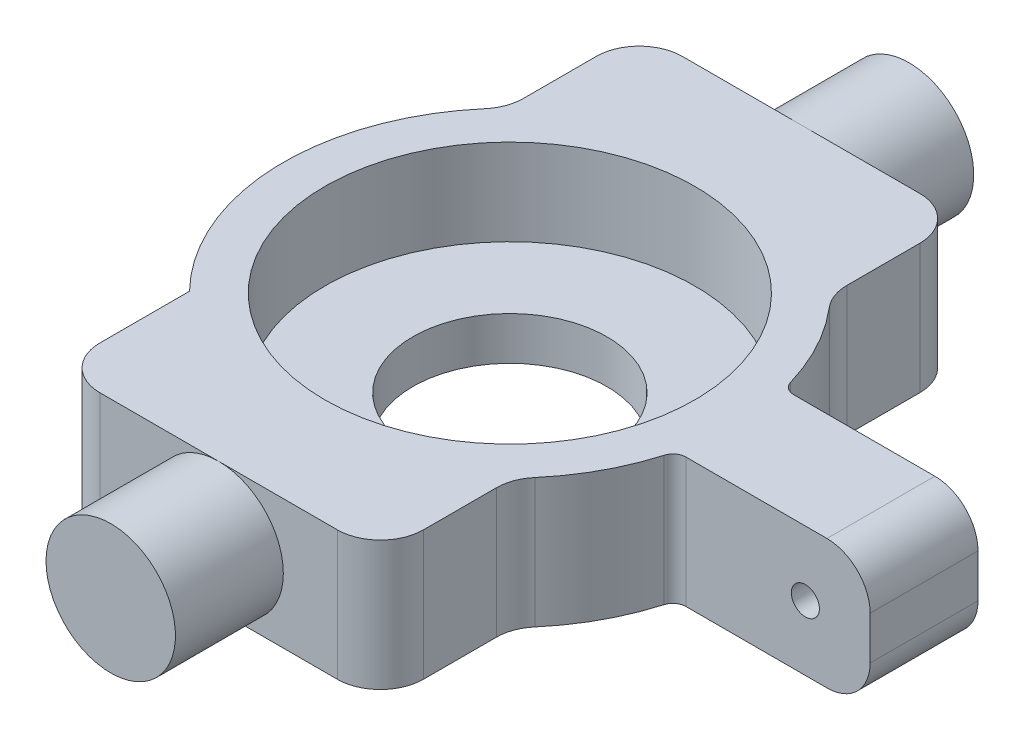
ISO-10303-21;
HEADER;
FILE_DESCRIPTION(('STEP AP214'),'2;1');
FILE_NAME('part.step','',(''),(''),'','','');
FILE_SCHEMA(('AUTOMOTIVE_DESIGN { 1 0 10303 214 1 1 1 1 }'));
ENDSEC;
DATA;
#1=APPLICATION_CONTEXT('core data for automotive mechanical design processes');
#2=APPLICATION_PROTOCOL_DEFINITION('international standard','automotive_design',2000,#1);
#3=PRODUCT_CONTEXT('',#1,'mechanical');
#4=PRODUCT('Part','Part','',(#3));
#5=PRODUCT_RELATED_PRODUCT_CATEGORY('part','',(#4));
#6=PRODUCT_DEFINITION_FORMATION('','',#4);
#7=PRODUCT_DEFINITION_CONTEXT('part definition',#1,'design');
#8=PRODUCT_DEFINITION('design','',#6,#7);
#9=PRODUCT_DEFINITION_SHAPE('','',#8);
#10=(LENGTH_UNIT() NAMED_UNIT(*) SI_UNIT(.MILLI.,.METRE.));
#11=(NAMED_UNIT(*) PLANE_ANGLE_UNIT() SI_UNIT($,.RADIAN.));
#12=(NAMED_UNIT(*) SI_UNIT($,.STERADIAN.) SOLID_ANGLE_UNIT());
#13=UNCERTAINTY_MEASURE_WITH_UNIT(LENGTH_MEASURE(1.E-05),#10,'distance_accuracy_value','');
#14=(GEOMETRIC_REPRESENTATION_CONTEXT(3) GLOBAL_UNCERTAINTY_ASSIGNED_CONTEXT((#13)) GLOBAL_UNIT_ASSIGNED_CONTEXT((#10,
#11,#12)) REPRESENTATION_CONTEXT('',''));
#15=CARTESIAN_POINT('',(0.,0.,0.));
#16=DIRECTION('',(0.,0.,1.));
#17=DIRECTION('',(1.,0.,0.));
#18=AXIS2_PLACEMENT_3D('',#15,#16,#17);
#19=CARTESIAN_POINT('',(0.,2.,0.));
#20=DIRECTION('',(0.,-1.,0.));
#21=DIRECTION('',(0.,0.,-1.));
#22=AXIS2_PLACEMENT_3D('',#19,#20,#21);
#23=CYLINDRICAL_SURFACE('',#22,10.5);
#24=CARTESIAN_POINT('',(0.,6.,0.));
#25=DIRECTION('',(0.,1.,0.));
#26=DIRECTION('',(0.,0.,1.));
#27=AXIS2_PLACEMENT_3D('',#24,#25,#26);
#28=CIRCLE('',#27,10.5);
#29=CARTESIAN_POINT('',(10.0822041255481,6.,-2.93243243243243));
#30=VERTEX_POINT('',#29);
#31=CARTESIAN_POINT('',(7.98,6.,-6.82419225989421));
#32=VERTEX_POINT('',#31);
#33=EDGE_CURVE('E428',#30,#32,#28,.T.);
#34=ORIENTED_EDGE('',*,*,#33,.F.);
#35=DIRECTION('',(0.,-1.,0.));
#36=VECTOR('',#35,1.);
#37=CARTESIAN_POINT('',(10.0822041255481,2.,-2.93243243243243));
#38=LINE('',#37,#36);
#39=CARTESIAN_POINT('',(10.0822041255481,0.,-2.93243243243243));
#40=VERTEX_POINT('',#39);
#41=EDGE_CURVE('E64',#30,#40,#38,.T.);
#42=ORIENTED_EDGE('',*,*,#41,.T.);
#43=CARTESIAN_POINT('',(0.,0.,0.));
#44=DIRECTION('',(0.,1.,0.));
#45=DIRECTION('',(0.,0.,1.));
#46=AXIS2_PLACEMENT_3D('',#43,#44,#45);
#47=CIRCLE('',#46,10.5);
#48=CARTESIAN_POINT('',(7.98,0.,-6.82419225989421));
#49=VERTEX_POINT('',#48);
#50=EDGE_CURVE('E262',#40,#49,#47,.T.);
#51=ORIENTED_EDGE('',*,*,#50,.T.);
#52=DIRECTION('',(0.,-1.,0.));
#53=VECTOR('',#52,1.);
#54=CARTESIAN_POINT('',(7.98,2.,-6.82419225989421));
#55=LINE('',#54,#53);
#56=EDGE_CURVE('E323',#49,#32,#55,.F.);
#57=ORIENTED_EDGE('',*,*,#56,.T.);
#58=EDGE_LOOP('',(#34,#42,#51,#57));
#59=FACE_BOUND('',#58,.T.);
#60=ADVANCED_FACE('F43',(#59),#23,.T.);
#61=CARTESIAN_POINT('',(0.,6.,13.5));
#62=DIRECTION('',(0.,0.,-1.));
#63=DIRECTION('',(-1.,0.,0.));
#64=AXIS2_PLACEMENT_3D('',#61,#62,#63);
#65=PLANE('',#64);
#66=DIRECTION('',(1.,0.,0.));
#67=VECTOR('',#66,1.);
#68=CARTESIAN_POINT('',(0.,0.,13.5));
#69=LINE('',#68,#67);
#70=CARTESIAN_POINT('',(0.,0.,13.5));
#71=VERTEX_POINT('',#70);
#72=CARTESIAN_POINT('',(5.5,0.,13.5));
#73=VERTEX_POINT('',#72);
#74=EDGE_CURVE('E220',#71,#73,#69,.T.);
#75=ORIENTED_EDGE('',*,*,#74,.T.);
#76=DIRECTION('',(0.,-1.,0.));
#77=VECTOR('',#76,1.);
#78=CARTESIAN_POINT('',(5.5,6.,13.5));
#79=LINE('',#78,#77);
#80=CARTESIAN_POINT('',(5.5,6.,13.5));
#81=VERTEX_POINT('',#80);
#82=EDGE_CURVE('E337',#73,#81,#79,.F.);
#83=ORIENTED_EDGE('',*,*,#82,.T.);
#84=DIRECTION('',(1.,0.,0.));
#85=VECTOR('',#84,1.);
#86=CARTESIAN_POINT('',(0.,6.,13.5));
#87=LINE('',#86,#85);
#88=CARTESIAN_POINT('',(0.,6.,13.5));
#89=VERTEX_POINT('',#88);
#90=EDGE_CURVE('E235',#89,#81,#87,.T.);
#91=ORIENTED_EDGE('',*,*,#90,.F.);
#92=CARTESIAN_POINT('',(0.,3.,13.5));
#93=DIRECTION('',(0.,0.,-1.));
#94=DIRECTION('',(-1.,0.,0.));
#95=AXIS2_PLACEMENT_3D('',#92,#93,#94);
#96=CIRCLE('',#95,3.);
#97=EDGE_CURVE('E226',#89,#71,#96,.T.);
#98=ORIENTED_EDGE('',*,*,#97,.T.);
#99=EDGE_LOOP('',(#75,#83,#91,#98));
#100=FACE_BOUND('',#99,.T.);
#101=ADVANCED_FACE('F232',(#100),#65,.F.);
#102=CARTESIAN_POINT('',(0.,6.,-13.5));
#103=DIRECTION('',(0.,0.,-1.));
#104=DIRECTION('',(-1.,0.,0.));
#105=AXIS2_PLACEMENT_3D('',#102,#103,#104);
#106=PLANE('',#105);
#107=DIRECTION('',(1.,0.,0.));
#108=VECTOR('',#107,1.);
#109=CARTESIAN_POINT('',(0.,6.,-13.5));
#110=LINE('',#109,#108);
#111=CARTESIAN_POINT('',(0.,6.,-13.5));
#112=VERTEX_POINT('',#111);
#113=CARTESIAN_POINT('',(5.5,6.,-13.5));
#114=VERTEX_POINT('',#113);
#115=EDGE_CURVE('E269',#112,#114,#110,.T.);
#116=ORIENTED_EDGE('',*,*,#115,.T.);
#117=DIRECTION('',(0.,-1.,0.));
#118=VECTOR('',#117,1.);
#119=CARTESIAN_POINT('',(5.5,6.,-13.5));
#120=LINE('',#119,#118);
#121=CARTESIAN_POINT('',(5.5,0.,-13.5));
#122=VERTEX_POINT('',#121);
#123=EDGE_CURVE('E315',#114,#122,#120,.T.);
#124=ORIENTED_EDGE('',*,*,#123,.T.);
#125=DIRECTION('',(1.,0.,0.));
#126=VECTOR('',#125,1.);
#127=CARTESIAN_POINT('',(0.,0.,-13.5));
#128=LINE('',#127,#126);
#129=CARTESIAN_POINT('',(0.,0.,-13.5));
#130=VERTEX_POINT('',#129);
#131=EDGE_CURVE('E279',#130,#122,#128,.T.);
#132=ORIENTED_EDGE('',*,*,#131,.F.);
#133=CARTESIAN_POINT('',(0.,3.,-13.5));
#134=DIRECTION('',(0.,0.,-1.));
#135=DIRECTION('',(-1.,0.,0.));
#136=AXIS2_PLACEMENT_3D('',#133,#134,#135);
#137=CIRCLE('',#136,3.);
#138=EDGE_CURVE('E419',#112,#130,#137,.T.);
#139=ORIENTED_EDGE('',*,*,#138,.F.);
#140=EDGE_LOOP('',(#116,#124,#132,#139));
#141=FACE_BOUND('',#140,.T.);
#142=ADVANCED_FACE('F480',(#141),#106,.T.);
#143=CARTESIAN_POINT('',(0.,2.,0.));
#144=DIRECTION('',(0.,1.,0.));
#145=DIRECTION('',(0.,0.,1.));
#146=AXIS2_PLACEMENT_3D('',#143,#144,#145);
#147=PLANE('',#146);
#148=CARTESIAN_POINT('',(0.,2.,0.));
#149=DIRECTION('',(0.,1.,0.));
#150=DIRECTION('',(0.,0.,1.));
#151=AXIS2_PLACEMENT_3D('',#148,#149,#150);
#152=CIRCLE('',#151,4.5);
#153=CARTESIAN_POINT('',(0.,2.,4.5));
#154=VERTEX_POINT('',#153);
#155=EDGE_CURVE('E255',#154,#154,#152,.T.);
#156=ORIENTED_EDGE('',*,*,#155,.F.);
#157=EDGE_LOOP('',(#156));
#158=FACE_BOUND('',#157,.T.);
#159=CARTESIAN_POINT('',(0.,2.,0.));
#160=DIRECTION('',(0.,1.,0.));
#161=DIRECTION('',(0.,0.,1.));
#162=AXIS2_PLACEMENT_3D('',#159,#160,#161);
#163=CIRCLE('',#162,8.575);
#164=CARTESIAN_POINT('',(0.,2.,8.575));
#165=VERTEX_POINT('',#164);
#166=EDGE_CURVE('E276',#165,#165,#163,.F.);
#167=ORIENTED_EDGE('',*,*,#166,.F.);
#168=EDGE_LOOP('',(#167));
#169=FACE_BOUND('',#168,.T.);
#170=ADVANCED_FACE('F526',(#158,#169),#147,.T.);
#171=CARTESIAN_POINT('',(-7.98,6.,-6.82419225989421));
#172=VERTEX_POINT('',#171);
#173=CARTESIAN_POINT('',(-7.5,6.,7.34846922834954));
#174=VERTEX_POINT('',#173);
#175=EDGE_CURVE('E429',#172,#174,#28,.T.);
#176=ORIENTED_EDGE('',*,*,#175,.F.);
#177=DIRECTION('',(0.,-1.,0.));
#178=VECTOR('',#177,1.);
#179=CARTESIAN_POINT('',(-7.98,2.,-6.82419225989421));
#180=LINE('',#179,#178);
#181=CARTESIAN_POINT('',(-7.98,0.,-6.82419225989421));
#182=VERTEX_POINT('',#181);
#183=EDGE_CURVE('E227',#172,#182,#180,.T.);
#184=ORIENTED_EDGE('',*,*,#183,.T.);
#185=CARTESIAN_POINT('',(-7.5,0.,7.34846922834954));
#186=VERTEX_POINT('',#185);
#187=EDGE_CURVE('E259',#182,#186,#47,.T.);
#188=ORIENTED_EDGE('',*,*,#187,.T.);
#189=DIRECTION('',(0.,-1.,0.));
#190=VECTOR('',#189,1.);
#191=CARTESIAN_POINT('',(-7.5,6.,7.34846922834954));
#192=LINE('',#191,#190);
#193=EDGE_CURVE('E250',#174,#186,#192,.T.);
#194=ORIENTED_EDGE('',*,*,#193,.F.);
#195=EDGE_LOOP('',(#176,#184,#188,#194));
#196=FACE_BOUND('',#195,.T.);
#197=ADVANCED_FACE('F459',(#196),#23,.T.);
#198=CARTESIAN_POINT('',(7.5,6.,0.));
#199=DIRECTION('',(1.,0.,0.));
#200=DIRECTION('',(0.,0.,-1.));
#201=AXIS2_PLACEMENT_3D('',#198,#199,#200);
#202=PLANE('',#201);
#203=DIRECTION('',(0.,0.,1.));
#204=VECTOR('',#203,1.);
#205=CARTESIAN_POINT('',(7.5,0.,0.));
#206=LINE('',#205,#204);
#207=CARTESIAN_POINT('',(7.5,0.,-11.5));
#208=VERTEX_POINT('',#207);
#209=CARTESIAN_POINT('',(7.5,0.,-8.12403840463596));
#210=VERTEX_POINT('',#209);
#211=EDGE_CURVE('E258',#208,#210,#206,.T.);
#212=ORIENTED_EDGE('',*,*,#211,.F.);
#213=DIRECTION('',(0.,-1.,0.));
#214=VECTOR('',#213,1.);
#215=CARTESIAN_POINT('',(7.5,6.,-11.5));
#216=LINE('',#215,#214);
#217=CARTESIAN_POINT('',(7.5,6.,-11.5));
#218=VERTEX_POINT('',#217);
#219=EDGE_CURVE('E321',#208,#218,#216,.F.);
#220=ORIENTED_EDGE('',*,*,#219,.T.);
#221=DIRECTION('',(0.,0.,1.));
#222=VECTOR('',#221,1.);
#223=CARTESIAN_POINT('',(7.5,6.,0.));
#224=LINE('',#223,#222);
#225=CARTESIAN_POINT('',(7.5,6.,-8.12403840463596));
#226=VERTEX_POINT('',#225);
#227=EDGE_CURVE('E266',#218,#226,#224,.T.);
#228=ORIENTED_EDGE('',*,*,#227,.T.);
#229=DIRECTION('',(0.,-1.,0.));
#230=VECTOR('',#229,1.);
#231=CARTESIAN_POINT('',(7.5,6.,-8.12403840463596));
#232=LINE('',#231,#230);
#233=EDGE_CURVE('E318',#226,#210,#232,.T.);
#234=ORIENTED_EDGE('',*,*,#233,.T.);
#235=EDGE_LOOP('',(#212,#220,#228,#234));
#236=FACE_BOUND('',#235,.T.);
#237=ADVANCED_FACE('F471',(#236),#202,.T.);
#238=CARTESIAN_POINT('',(-5.5,0.,-13.5));
#239=VERTEX_POINT('',#238);
#240=EDGE_CURVE('E280',#239,#130,#128,.T.);
#241=ORIENTED_EDGE('',*,*,#240,.F.);
#242=DIRECTION('',(0.,-1.,0.));
#243=VECTOR('',#242,1.);
#244=CARTESIAN_POINT('',(-5.5,6.,-13.5));
#245=LINE('',#244,#243);
#246=CARTESIAN_POINT('',(-5.5,6.,-13.5));
#247=VERTEX_POINT('',#246);
#248=EDGE_CURVE('E302',#239,#247,#245,.F.);
#249=ORIENTED_EDGE('',*,*,#248,.T.);
#250=EDGE_CURVE('E271',#247,#112,#110,.T.);
#251=ORIENTED_EDGE('',*,*,#250,.T.);
#252=EDGE_CURVE('E228',#130,#112,#137,.T.);
#253=ORIENTED_EDGE('',*,*,#252,.F.);
#254=EDGE_LOOP('',(#241,#249,#251,#253));
#255=FACE_BOUND('',#254,.T.);
#256=ADVANCED_FACE('F489',(#255),#106,.T.);
#257=CARTESIAN_POINT('',(-7.5,6.,0.));
#258=DIRECTION('',(-1.,0.,0.));
#259=DIRECTION('',(0.,0.,1.));
#260=AXIS2_PLACEMENT_3D('',#257,#258,#259);
#261=PLANE('',#260);
#262=DIRECTION('',(0.,0.,-1.));
#263=VECTOR('',#262,1.);
#264=CARTESIAN_POINT('',(-7.5,0.,0.));
#265=LINE('',#264,#263);
#266=CARTESIAN_POINT('',(-7.5,0.,-8.12403840463596));
#267=VERTEX_POINT('',#266);
#268=CARTESIAN_POINT('',(-7.5,0.,-11.5));
#269=VERTEX_POINT('',#268);
#270=EDGE_CURVE('E270',#267,#269,#265,.T.);
#271=ORIENTED_EDGE('',*,*,#270,.F.);
#272=DIRECTION('',(0.,-1.,0.));
#273=VECTOR('',#272,1.);
#274=CARTESIAN_POINT('',(-7.5,6.,-8.12403840463596));
#275=LINE('',#274,#273);
#276=CARTESIAN_POINT('',(-7.5,6.,-8.12403840463596));
#277=VERTEX_POINT('',#276);
#278=EDGE_CURVE('E290',#267,#277,#275,.F.);
#279=ORIENTED_EDGE('',*,*,#278,.T.);
#280=DIRECTION('',(0.,0.,-1.));
#281=VECTOR('',#280,1.);
#282=CARTESIAN_POINT('',(-7.5,6.,0.));
#283=LINE('',#282,#281);
#284=CARTESIAN_POINT('',(-7.5,6.,-11.5));
#285=VERTEX_POINT('',#284);
#286=EDGE_CURVE('E273',#277,#285,#283,.T.);
#287=ORIENTED_EDGE('',*,*,#286,.T.);
#288=DIRECTION('',(0.,-1.,0.));
#289=VECTOR('',#288,1.);
#290=CARTESIAN_POINT('',(-7.5,6.,-11.5));
#291=LINE('',#290,#289);
#292=EDGE_CURVE('E287',#285,#269,#291,.T.);
#293=ORIENTED_EDGE('',*,*,#292,.T.);
#294=EDGE_LOOP('',(#271,#279,#287,#293));
#295=FACE_BOUND('',#294,.T.);
#296=ADVANCED_FACE('F498',(#295),#261,.T.);
#297=CARTESIAN_POINT('',(0.,6.,0.));
#298=DIRECTION('',(0.,1.,0.));
#299=DIRECTION('',(0.,0.,1.));
#300=AXIS2_PLACEMENT_3D('',#297,#298,#299);
#301=PLANE('',#300);
#302=ORIENTED_EDGE('',*,*,#250,.F.);
#303=CARTESIAN_POINT('',(-5.5,6.,-11.5));
#304=DIRECTION('',(0.,1.,0.));
#305=DIRECTION('',(0.,0.,1.));
#306=AXIS2_PLACEMENT_3D('',#303,#304,#305);
#307=CIRCLE('',#306,2.);
#308=EDGE_CURVE('E313',#247,#285,#307,.T.);
#309=ORIENTED_EDGE('',*,*,#308,.T.);
#310=ORIENTED_EDGE('',*,*,#286,.F.);
#311=CARTESIAN_POINT('',(-9.5,6.,-8.12403840463596));
#312=DIRECTION('',(0.,1.,0.));
#313=DIRECTION('',(0.,0.,1.));
#314=AXIS2_PLACEMENT_3D('',#311,#312,#313);
#315=CIRCLE('',#314,2.);
#316=EDGE_CURVE('E355',#277,#172,#315,.F.);
#317=ORIENTED_EDGE('',*,*,#316,.T.);
#318=ORIENTED_EDGE('',*,*,#175,.T.);
#319=DIRECTION('',(0.,0.,-1.));
#320=VECTOR('',#319,1.);
#321=CARTESIAN_POINT('',(-7.5,6.,0.));
#322=LINE('',#321,#320);
#323=CARTESIAN_POINT('',(-7.5,6.,11.5));
#324=VERTEX_POINT('',#323);
#325=EDGE_CURVE('E249',#324,#174,#322,.T.);
#326=ORIENTED_EDGE('',*,*,#325,.F.);
#327=CARTESIAN_POINT('',(-5.5,6.,11.5));
#328=DIRECTION('',(0.,1.,0.));
#329=DIRECTION('',(0.,0.,1.));
#330=AXIS2_PLACEMENT_3D('',#327,#328,#329);
#331=CIRCLE('',#330,2.);
#332=CARTESIAN_POINT('',(-5.5,6.,13.5));
#333=VERTEX_POINT('',#332);
#334=EDGE_CURVE('E309',#324,#333,#331,.T.);
#335=ORIENTED_EDGE('',*,*,#334,.T.);
#336=EDGE_CURVE('E433',#333,#89,#87,.T.);
#337=ORIENTED_EDGE('',*,*,#336,.T.);
#338=ORIENTED_EDGE('',*,*,#90,.T.);
#339=CARTESIAN_POINT('',(5.5,6.,11.5));
#340=DIRECTION('',(0.,1.,0.));
#341=DIRECTION('',(0.,0.,1.));
#342=AXIS2_PLACEMENT_3D('',#339,#340,#341);
#343=CIRCLE('',#342,2.);
#344=CARTESIAN_POINT('',(7.5,6.,11.5));
#345=VERTEX_POINT('',#344);
#346=EDGE_CURVE('E307',#81,#345,#343,.T.);
#347=ORIENTED_EDGE('',*,*,#346,.T.);
#348=DIRECTION('',(0.,0.,1.));
#349=VECTOR('',#348,1.);
#350=CARTESIAN_POINT('',(7.5,6.,0.));
#351=LINE('',#350,#349);
#352=CARTESIAN_POINT('',(7.5,6.,8.12403840463596));
#353=VERTEX_POINT('',#352);
#354=EDGE_CURVE('E254',#353,#345,#351,.T.);
#355=ORIENTED_EDGE('',*,*,#354,.F.);
#356=CARTESIAN_POINT('',(9.5,6.,8.12403840463596));
#357=DIRECTION('',(0.,1.,0.));
#358=DIRECTION('',(0.,0.,1.));
#359=AXIS2_PLACEMENT_3D('',#356,#357,#358);
#360=CIRCLE('',#359,2.);
#361=CARTESIAN_POINT('',(7.98,6.,6.82419225989421));
#362=VERTEX_POINT('',#361);
#363=EDGE_CURVE('E364',#353,#362,#360,.F.);
#364=ORIENTED_EDGE('',*,*,#363,.T.);
#365=CARTESIAN_POINT('',(10.0822041255481,6.,2.93243243243243));
#366=VERTEX_POINT('',#365);
#367=EDGE_CURVE('E244',#362,#366,#28,.T.);
#368=ORIENTED_EDGE('',*,*,#367,.T.);
#369=CARTESIAN_POINT('',(10.6583300755794,6.,3.1));
#370=DIRECTION('',(0.,1.,0.));
#371=DIRECTION('',(0.,0.,1.));
#372=AXIS2_PLACEMENT_3D('',#369,#370,#371);
#373=CIRCLE('',#372,0.6);
#374=CARTESIAN_POINT('',(10.6583300755794,6.,2.5));
#375=VERTEX_POINT('',#374);
#376=EDGE_CURVE('E375',#366,#375,#373,.F.);
#377=ORIENTED_EDGE('',*,*,#376,.T.);
#378=DIRECTION('',(1.,0.,0.));
#379=VECTOR('',#378,1.);
#380=CARTESIAN_POINT('',(10.1980390271856,6.,2.5));
#381=LINE('',#380,#379);
#382=CARTESIAN_POINT('',(17.1980390271856,6.,2.5));
#383=VERTEX_POINT('',#382);
#384=EDGE_CURVE('E395',#375,#383,#381,.T.);
#385=ORIENTED_EDGE('',*,*,#384,.T.);
#386=DIRECTION('',(0.,0.,-1.));
#387=VECTOR('',#386,1.);
#388=CARTESIAN_POINT('',(17.1980390271856,6.,0.));
#389=LINE('',#388,#387);
#390=CARTESIAN_POINT('',(17.1980390271856,6.,-2.5));
#391=VERTEX_POINT('',#390);
#392=EDGE_CURVE('E304',#383,#391,#389,.T.);
#393=ORIENTED_EDGE('',*,*,#392,.T.);
#394=DIRECTION('',(-1.,0.,0.));
#395=VECTOR('',#394,1.);
#396=CARTESIAN_POINT('',(10.1980390271856,6.,-2.5));
#397=LINE('',#396,#395);
#398=CARTESIAN_POINT('',(10.6583300755794,6.,-2.5));
#399=VERTEX_POINT('',#398);
#400=EDGE_CURVE('E401',#391,#399,#397,.T.);
#401=ORIENTED_EDGE('',*,*,#400,.T.);
#402=CARTESIAN_POINT('',(10.6583300755794,6.,-3.1));
#403=DIRECTION('',(0.,1.,0.));
#404=DIRECTION('',(0.,0.,1.));
#405=AXIS2_PLACEMENT_3D('',#402,#403,#404);
#406=CIRCLE('',#405,0.6);
#407=EDGE_CURVE('E51',#399,#30,#406,.F.);
#408=ORIENTED_EDGE('',*,*,#407,.T.);
#409=ORIENTED_EDGE('',*,*,#33,.T.);
#410=CARTESIAN_POINT('',(9.5,6.,-8.12403840463596));
#411=DIRECTION('',(0.,1.,0.));
#412=DIRECTION('',(0.,0.,1.));
#413=AXIS2_PLACEMENT_3D('',#410,#411,#412);
#414=CIRCLE('',#413,2.);
#415=EDGE_CURVE('E360',#32,#226,#414,.F.);
#416=ORIENTED_EDGE('',*,*,#415,.T.);
#417=ORIENTED_EDGE('',*,*,#227,.F.);
#418=CARTESIAN_POINT('',(5.5,6.,-11.5));
#419=DIRECTION('',(0.,1.,0.));
#420=DIRECTION('',(0.,0.,1.));
#421=AXIS2_PLACEMENT_3D('',#418,#419,#420);
#422=CIRCLE('',#421,2.);
#423=EDGE_CURVE('E311',#218,#114,#422,.T.);
#424=ORIENTED_EDGE('',*,*,#423,.T.);
#425=ORIENTED_EDGE('',*,*,#115,.F.);
#426=EDGE_LOOP('',(#302,#309,#310,#317,#318,#326,#335,#337,#338,#347,#355,#364,#368,#377,#385,
#393,#401,#408,#409,#416,#417,#424,#425));
#427=FACE_BOUND('',#426,.T.);
#428=CARTESIAN_POINT('',(0.,6.,0.));
#429=DIRECTION('',(0.,1.,0.));
#430=DIRECTION('',(0.,0.,1.));
#431=AXIS2_PLACEMENT_3D('',#428,#429,#430);
#432=CIRCLE('',#431,8.575);
#433=CARTESIAN_POINT('',(0.,6.,8.575));
#434=VERTEX_POINT('',#433);
#435=EDGE_CURVE('E424',#434,#434,#432,.T.);
#436=ORIENTED_EDGE('',*,*,#435,.F.);
#437=EDGE_LOOP('',(#436));
#438=FACE_BOUND('',#437,.T.);
#439=ADVANCED_FACE('F393',(#427,#438),#301,.T.);
#440=CARTESIAN_POINT('',(0.,0.,0.));
#441=DIRECTION('',(0.,1.,0.));
#442=DIRECTION('',(0.,0.,1.));
#443=AXIS2_PLACEMENT_3D('',#440,#441,#442);
#444=PLANE('',#443);
#445=ORIENTED_EDGE('',*,*,#270,.T.);
#446=CARTESIAN_POINT('',(-5.5,0.,-11.5));
#447=DIRECTION('',(0.,1.,0.));
#448=DIRECTION('',(0.,0.,1.));
#449=AXIS2_PLACEMENT_3D('',#446,#447,#448);
#450=CIRCLE('',#449,2.);
#451=EDGE_CURVE('E300',#269,#239,#450,.F.);
#452=ORIENTED_EDGE('',*,*,#451,.T.);
#453=ORIENTED_EDGE('',*,*,#240,.T.);
#454=ORIENTED_EDGE('',*,*,#131,.T.);
#455=CARTESIAN_POINT('',(5.5,0.,-11.5));
#456=DIRECTION('',(0.,1.,0.));
#457=DIRECTION('',(0.,0.,1.));
#458=AXIS2_PLACEMENT_3D('',#455,#456,#457);
#459=CIRCLE('',#458,2.);
#460=EDGE_CURVE('E298',#122,#208,#459,.F.);
#461=ORIENTED_EDGE('',*,*,#460,.T.);
#462=ORIENTED_EDGE('',*,*,#211,.T.);
#463=CARTESIAN_POINT('',(9.5,0.,-8.12403840463596));
#464=DIRECTION('',(0.,1.,0.));
#465=DIRECTION('',(0.,0.,1.));
#466=AXIS2_PLACEMENT_3D('',#463,#464,#465);
#467=CIRCLE('',#466,2.);
#468=EDGE_CURVE('E357',#210,#49,#467,.T.);
#469=ORIENTED_EDGE('',*,*,#468,.T.);
#470=ORIENTED_EDGE('',*,*,#50,.F.);
#471=CARTESIAN_POINT('',(10.6583300755794,0.,-3.1));
#472=DIRECTION('',(0.,1.,0.));
#473=DIRECTION('',(0.,0.,1.));
#474=AXIS2_PLACEMENT_3D('',#471,#472,#473);
#475=CIRCLE('',#474,0.6);
#476=CARTESIAN_POINT('',(10.6583300755794,0.,-2.5));
#477=VERTEX_POINT('',#476);
#478=EDGE_CURVE('E11',#40,#477,#475,.T.);
#479=ORIENTED_EDGE('',*,*,#478,.T.);
#480=DIRECTION('',(1.,0.,0.));
#481=VECTOR('',#480,1.);
#482=CARTESIAN_POINT('',(10.1980390271856,0.,-2.5));
#483=LINE('',#482,#481);
#484=CARTESIAN_POINT('',(17.1980390271856,0.,-2.5));
#485=VERTEX_POINT('',#484);
#486=EDGE_CURVE('E410',#477,#485,#483,.T.);
#487=ORIENTED_EDGE('',*,*,#486,.T.);
#488=DIRECTION('',(0.,0.,1.));
#489=VECTOR('',#488,1.);
#490=CARTESIAN_POINT('',(17.1980390271856,0.,2.5));
#491=LINE('',#490,#489);
#492=CARTESIAN_POINT('',(17.1980390271856,0.,2.5));
#493=VERTEX_POINT('',#492);
#494=EDGE_CURVE('E292',#485,#493,#491,.T.);
#495=ORIENTED_EDGE('',*,*,#494,.T.);
#496=DIRECTION('',(-1.,0.,0.));
#497=VECTOR('',#496,1.);
#498=CARTESIAN_POINT('',(10.1980390271856,0.,2.5));
#499=LINE('',#498,#497);
#500=CARTESIAN_POINT('',(10.6583300755794,0.,2.5));
#501=VERTEX_POINT('',#500);
#502=EDGE_CURVE('E237',#493,#501,#499,.T.);
#503=ORIENTED_EDGE('',*,*,#502,.T.);
#504=CARTESIAN_POINT('',(10.6583300755794,0.,3.1));
#505=DIRECTION('',(0.,1.,0.));
#506=DIRECTION('',(0.,0.,1.));
#507=AXIS2_PLACEMENT_3D('',#504,#505,#506);
#508=CIRCLE('',#507,0.6);
#509=CARTESIAN_POINT('',(10.0822041255481,0.,2.93243243243243));
#510=VERTEX_POINT('',#509);
#511=EDGE_CURVE('E377',#501,#510,#508,.T.);
#512=ORIENTED_EDGE('',*,*,#511,.T.);
#513=CARTESIAN_POINT('',(7.98,0.,6.82419225989421));
#514=VERTEX_POINT('',#513);
#515=EDGE_CURVE('E263',#514,#510,#47,.T.);
#516=ORIENTED_EDGE('',*,*,#515,.F.);
#517=CARTESIAN_POINT('',(9.5,0.,8.12403840463596));
#518=DIRECTION('',(0.,1.,0.));
#519=DIRECTION('',(0.,0.,1.));
#520=AXIS2_PLACEMENT_3D('',#517,#518,#519);
#521=CIRCLE('',#520,2.);
#522=CARTESIAN_POINT('',(7.5,0.,8.12403840463596));
#523=VERTEX_POINT('',#522);
#524=EDGE_CURVE('E362',#514,#523,#521,.T.);
#525=ORIENTED_EDGE('',*,*,#524,.T.);
#526=DIRECTION('',(0.,0.,1.));
#527=VECTOR('',#526,1.);
#528=CARTESIAN_POINT('',(7.5,0.,0.));
#529=LINE('',#528,#527);
#530=CARTESIAN_POINT('',(7.5,0.,11.5));
#531=VERTEX_POINT('',#530);
#532=EDGE_CURVE('E219',#523,#531,#529,.T.);
#533=ORIENTED_EDGE('',*,*,#532,.T.);
#534=CARTESIAN_POINT('',(5.5,0.,11.5));
#535=DIRECTION('',(0.,1.,0.));
#536=DIRECTION('',(0.,0.,1.));
#537=AXIS2_PLACEMENT_3D('',#534,#535,#536);
#538=CIRCLE('',#537,2.);
#539=EDGE_CURVE('E242',#531,#73,#538,.F.);
#540=ORIENTED_EDGE('',*,*,#539,.T.);
#541=ORIENTED_EDGE('',*,*,#74,.F.);
#542=CARTESIAN_POINT('',(-5.5,0.,13.5));
#543=VERTEX_POINT('',#542);
#544=EDGE_CURVE('E209',#543,#71,#69,.T.);
#545=ORIENTED_EDGE('',*,*,#544,.F.);
#546=CARTESIAN_POINT('',(-5.5,0.,11.5));
#547=DIRECTION('',(0.,1.,0.));
#548=DIRECTION('',(0.,0.,1.));
#549=AXIS2_PLACEMENT_3D('',#546,#547,#548);
#550=CIRCLE('',#549,2.);
#551=CARTESIAN_POINT('',(-7.5,0.,11.5));
#552=VERTEX_POINT('',#551);
#553=EDGE_CURVE('E296',#543,#552,#550,.F.);
#554=ORIENTED_EDGE('',*,*,#553,.T.);
#555=DIRECTION('',(0.,0.,-1.));
#556=VECTOR('',#555,1.);
#557=CARTESIAN_POINT('',(-7.5,0.,0.));
#558=LINE('',#557,#556);
#559=EDGE_CURVE('E243',#552,#186,#558,.T.);
#560=ORIENTED_EDGE('',*,*,#559,.T.);
#561=ORIENTED_EDGE('',*,*,#187,.F.);
#562=CARTESIAN_POINT('',(-9.5,0.,-8.12403840463596));
#563=DIRECTION('',(0.,1.,0.));
#564=DIRECTION('',(0.,0.,1.));
#565=AXIS2_PLACEMENT_3D('',#562,#563,#564);
#566=CIRCLE('',#565,2.);
#567=EDGE_CURVE('E353',#182,#267,#566,.T.);
#568=ORIENTED_EDGE('',*,*,#567,.T.);
#569=EDGE_LOOP('',(#445,#452,#453,#454,#461,#462,#469,#470,#479,#487,#495,#503,#512,#516,#525,
#533,#540,#541,#545,#554,#560,#561,#568));
#570=FACE_BOUND('',#569,.T.);
#571=CARTESIAN_POINT('',(0.,0.,0.));
#572=DIRECTION('',(0.,1.,0.));
#573=DIRECTION('',(0.,0.,1.));
#574=AXIS2_PLACEMENT_3D('',#571,#572,#573);
#575=CIRCLE('',#574,4.5);
#576=CARTESIAN_POINT('',(0.,0.,4.5));
#577=VERTEX_POINT('',#576);
#578=EDGE_CURVE('E253',#577,#577,#575,.T.);
#579=ORIENTED_EDGE('',*,*,#578,.T.);
#580=EDGE_LOOP('',(#579));
#581=FACE_BOUND('',#580,.T.);
#582=ADVANCED_FACE('F239',(#570,#581),#444,.F.);
#583=CARTESIAN_POINT('',(0.,2.,0.));
#584=DIRECTION('',(0.,-1.,0.));
#585=DIRECTION('',(0.,0.,-1.));
#586=AXIS2_PLACEMENT_3D('',#583,#584,#585);
#587=CYLINDRICAL_SURFACE('',#586,4.5);
#588=ORIENTED_EDGE('',*,*,#155,.T.);
#589=EDGE_LOOP('',(#588));
#590=FACE_BOUND('',#589,.T.);
#591=ORIENTED_EDGE('',*,*,#578,.F.);
#592=EDGE_LOOP('',(#591));
#593=FACE_BOUND('',#592,.T.);
#594=ADVANCED_FACE('F528',(#590,#593),#587,.F.);
#595=ORIENTED_EDGE('',*,*,#515,.T.);
#596=DIRECTION('',(0.,-1.,0.));
#597=VECTOR('',#596,1.);
#598=CARTESIAN_POINT('',(10.0822041255481,2.,2.93243243243243));
#599=LINE('',#598,#597);
#600=EDGE_CURVE('E366',#510,#366,#599,.F.);
#601=ORIENTED_EDGE('',*,*,#600,.T.);
#602=ORIENTED_EDGE('',*,*,#367,.F.);
#603=DIRECTION('',(0.,-1.,0.));
#604=VECTOR('',#603,1.);
#605=CARTESIAN_POINT('',(7.98,2.,6.82419225989421));
#606=LINE('',#605,#604);
#607=EDGE_CURVE('E326',#362,#514,#606,.T.);
#608=ORIENTED_EDGE('',*,*,#607,.T.);
#609=EDGE_LOOP('',(#595,#601,#602,#608));
#610=FACE_BOUND('',#609,.T.);
#611=ADVANCED_FACE('F386',(#610),#23,.T.);
#612=CARTESIAN_POINT('',(-7.5,6.,0.));
#613=DIRECTION('',(-1.,0.,0.));
#614=DIRECTION('',(0.,0.,1.));
#615=AXIS2_PLACEMENT_3D('',#612,#613,#614);
#616=PLANE('',#615);
#617=ORIENTED_EDGE('',*,*,#559,.F.);
#618=DIRECTION('',(0.,-1.,0.));
#619=VECTOR('',#618,1.);
#620=CARTESIAN_POINT('',(-7.5,6.,11.5));
#621=LINE('',#620,#619);
#622=EDGE_CURVE('E335',#552,#324,#621,.F.);
#623=ORIENTED_EDGE('',*,*,#622,.T.);
#624=ORIENTED_EDGE('',*,*,#325,.T.);
#625=ORIENTED_EDGE('',*,*,#193,.T.);
#626=EDGE_LOOP('',(#617,#623,#624,#625));
#627=FACE_BOUND('',#626,.T.);
#628=ADVANCED_FACE('F454',(#627),#616,.T.);
#629=ORIENTED_EDGE('',*,*,#336,.F.);
#630=DIRECTION('',(0.,-1.,0.));
#631=VECTOR('',#630,1.);
#632=CARTESIAN_POINT('',(-5.5,0.,13.5));
#633=LINE('',#632,#631);
#634=EDGE_CURVE('E216',#333,#543,#633,.T.);
#635=ORIENTED_EDGE('',*,*,#634,.T.);
#636=ORIENTED_EDGE('',*,*,#544,.T.);
#637=EDGE_CURVE('E213',#71,#89,#96,.T.);
#638=ORIENTED_EDGE('',*,*,#637,.T.);
#639=EDGE_LOOP('',(#629,#635,#636,#638));
#640=FACE_BOUND('',#639,.T.);
#641=ADVANCED_FACE('F212',(#640),#65,.F.);
#642=CARTESIAN_POINT('',(7.5,6.,0.));
#643=DIRECTION('',(1.,0.,0.));
#644=DIRECTION('',(0.,0.,-1.));
#645=AXIS2_PLACEMENT_3D('',#642,#643,#644);
#646=PLANE('',#645);
#647=ORIENTED_EDGE('',*,*,#532,.F.);
#648=DIRECTION('',(0.,-1.,0.));
#649=VECTOR('',#648,1.);
#650=CARTESIAN_POINT('',(7.5,6.,8.12403840463596));
#651=LINE('',#650,#649);
#652=EDGE_CURVE('E332',#523,#353,#651,.F.);
#653=ORIENTED_EDGE('',*,*,#652,.T.);
#654=ORIENTED_EDGE('',*,*,#354,.T.);
#655=DIRECTION('',(0.,-1.,0.));
#656=VECTOR('',#655,1.);
#657=CARTESIAN_POINT('',(7.5,0.,11.5));
#658=LINE('',#657,#656);
#659=EDGE_CURVE('E329',#345,#531,#658,.T.);
#660=ORIENTED_EDGE('',*,*,#659,.T.);
#661=EDGE_LOOP('',(#647,#653,#654,#660));
#662=FACE_BOUND('',#661,.T.);
#663=ADVANCED_FACE('F439',(#662),#646,.T.);
#664=CARTESIAN_POINT('',(0.,35.698484809835,0.));
#665=DIRECTION('',(0.,-1.,0.));
#666=DIRECTION('',(0.,0.,-1.));
#667=AXIS2_PLACEMENT_3D('',#664,#665,#666);
#668=CYLINDRICAL_SURFACE('',#667,8.575);
#669=ORIENTED_EDGE('',*,*,#166,.T.);
#670=EDGE_LOOP('',(#669));
#671=FACE_BOUND('',#670,.T.);
#672=ORIENTED_EDGE('',*,*,#435,.T.);
#673=EDGE_LOOP('',(#672));
#674=FACE_BOUND('',#673,.T.);
#675=ADVANCED_FACE('F580',(#671,#674),#668,.F.);
#676=CARTESIAN_POINT('',(0.,3.,-18.5));
#677=DIRECTION('',(0.,0.,1.));
#678=DIRECTION('',(1.,0.,0.));
#679=AXIS2_PLACEMENT_3D('',#676,#677,#678);
#680=CYLINDRICAL_SURFACE('',#679,3.);
#681=CARTESIAN_POINT('',(0.,3.,-18.5));
#682=DIRECTION('',(0.,0.,-1.));
#683=DIRECTION('',(-1.,0.,0.));
#684=AXIS2_PLACEMENT_3D('',#681,#682,#683);
#685=CIRCLE('',#684,3.);
#686=CARTESIAN_POINT('',(-3.,3.,-18.5));
#687=VERTEX_POINT('',#686);
#688=EDGE_CURVE('E421',#687,#687,#685,.T.);
#689=ORIENTED_EDGE('',*,*,#688,.F.);
#690=EDGE_LOOP('',(#689));
#691=FACE_BOUND('',#690,.T.);
#692=ORIENTED_EDGE('',*,*,#138,.T.);
#693=ORIENTED_EDGE('',*,*,#252,.T.);
#694=EDGE_LOOP('',(#692,#693));
#695=FACE_BOUND('',#694,.T.);
#696=ADVANCED_FACE('F486',(#691,#695),#680,.T.);
#697=CARTESIAN_POINT('',(0.,3.,-18.5));
#698=DIRECTION('',(0.,0.,-1.));
#699=DIRECTION('',(-1.,0.,0.));
#700=AXIS2_PLACEMENT_3D('',#697,#698,#699);
#701=PLANE('',#700);
#702=ORIENTED_EDGE('',*,*,#688,.T.);
#703=EDGE_LOOP('',(#702));
#704=FACE_BOUND('',#703,.T.);
#705=ADVANCED_FACE('F722',(#704),#701,.T.);
#706=CARTESIAN_POINT('',(0.,3.,18.5));
#707=DIRECTION('',(0.,0.,-1.));
#708=DIRECTION('',(-1.,0.,0.));
#709=AXIS2_PLACEMENT_3D('',#706,#707,#708);
#710=CYLINDRICAL_SURFACE('',#709,3.);
#711=CARTESIAN_POINT('',(0.,3.,18.5));
#712=DIRECTION('',(0.,0.,-1.));
#713=DIRECTION('',(-1.,0.,0.));
#714=AXIS2_PLACEMENT_3D('',#711,#712,#713);
#715=CIRCLE('',#714,3.);
#716=CARTESIAN_POINT('',(-3.,3.,18.5));
#717=VERTEX_POINT('',#716);
#718=EDGE_CURVE('E236',#717,#717,#715,.T.);
#719=ORIENTED_EDGE('',*,*,#718,.T.);
#720=EDGE_LOOP('',(#719));
#721=FACE_BOUND('',#720,.T.);
#722=ORIENTED_EDGE('',*,*,#97,.F.);
#723=ORIENTED_EDGE('',*,*,#637,.F.);
#724=EDGE_LOOP('',(#722,#723));
#725=FACE_BOUND('',#724,.T.);
#726=ADVANCED_FACE('F225',(#721,#725),#710,.T.);
#727=CARTESIAN_POINT('',(0.,3.,18.5));
#728=DIRECTION('',(0.,0.,1.));
#729=DIRECTION('',(-1.,0.,0.));
#730=AXIS2_PLACEMENT_3D('',#727,#728,#729);
#731=PLANE('',#730);
#732=ORIENTED_EDGE('',*,*,#718,.F.);
#733=EDGE_LOOP('',(#732));
#734=FACE_BOUND('',#733,.T.);
#735=ADVANCED_FACE('F712',(#734),#731,.T.);
#736=CARTESIAN_POINT('',(10.1980390271856,-10.295630140987,-2.5));
#737=DIRECTION('',(0.,0.,-1.));
#738=DIRECTION('',(-1.,0.,0.));
#739=AXIS2_PLACEMENT_3D('',#736,#737,#738);
#740=PLANE('',#739);
#741=CARTESIAN_POINT('',(16.1980390271856,3.,-2.5));
#742=DIRECTION('',(0.,0.,-1.));
#743=DIRECTION('',(-1.,0.,0.));
#744=AXIS2_PLACEMENT_3D('',#741,#742,#743);
#745=CIRCLE('',#744,0.649999999999999);
#746=CARTESIAN_POINT('',(15.5480390271856,3.,-2.5));
#747=VERTEX_POINT('',#746);
#748=EDGE_CURVE('E402',#747,#747,#745,.T.);
#749=ORIENTED_EDGE('',*,*,#748,.F.);
#750=EDGE_LOOP('',(#749));
#751=FACE_BOUND('',#750,.T.);
#752=ORIENTED_EDGE('',*,*,#486,.F.);
#753=DIRECTION('',(0.,-1.,0.));
#754=VECTOR('',#753,1.);
#755=CARTESIAN_POINT('',(10.6583300755794,-10.295630140987,-2.5));
#756=LINE('',#755,#754);
#757=EDGE_CURVE('E371',#477,#399,#756,.F.);
#758=ORIENTED_EDGE('',*,*,#757,.T.);
#759=ORIENTED_EDGE('',*,*,#400,.F.);
#760=CARTESIAN_POINT('',(17.1980390271856,4.,-2.5));
#761=DIRECTION('',(0.,0.,-1.));
#762=DIRECTION('',(-1.,0.,0.));
#763=AXIS2_PLACEMENT_3D('',#760,#761,#762);
#764=CIRCLE('',#763,2.);
#765=CARTESIAN_POINT('',(19.1980390271856,4.,-2.5));
#766=VERTEX_POINT('',#765);
#767=EDGE_CURVE('E348',#391,#766,#764,.T.);
#768=ORIENTED_EDGE('',*,*,#767,.T.);
#769=DIRECTION('',(0.,1.,0.));
#770=VECTOR('',#769,1.);
#771=CARTESIAN_POINT('',(19.1980390271856,-10.295630140987,-2.5));
#772=LINE('',#771,#770);
#773=CARTESIAN_POINT('',(19.1980390271856,2.,-2.5));
#774=VERTEX_POINT('',#773);
#775=EDGE_CURVE('E413',#774,#766,#772,.T.);
#776=ORIENTED_EDGE('',*,*,#775,.F.);
#777=CARTESIAN_POINT('',(17.1980390271856,2.,-2.5));
#778=DIRECTION('',(0.,0.,-1.));
#779=DIRECTION('',(-1.,0.,0.));
#780=AXIS2_PLACEMENT_3D('',#777,#778,#779);
#781=CIRCLE('',#780,2.);
#782=EDGE_CURVE('E350',#774,#485,#781,.T.);
#783=ORIENTED_EDGE('',*,*,#782,.T.);
#784=EDGE_LOOP('',(#752,#758,#759,#768,#776,#783));
#785=FACE_BOUND('',#784,.T.);
#786=ADVANCED_FACE('F588',(#751,#785),#740,.T.);
#787=CARTESIAN_POINT('',(19.1980390271856,-10.295630140987,2.5));
#788=DIRECTION('',(1.,0.,0.));
#789=DIRECTION('',(0.,0.,-1.));
#790=AXIS2_PLACEMENT_3D('',#787,#788,#789);
#791=PLANE('',#790);
#792=DIRECTION('',(0.,1.,0.));
#793=VECTOR('',#792,1.);
#794=CARTESIAN_POINT('',(19.1980390271856,-10.295630140987,2.5));
#795=LINE('',#794,#793);
#796=CARTESIAN_POINT('',(19.1980390271856,2.,2.5));
#797=VERTEX_POINT('',#796);
#798=CARTESIAN_POINT('',(19.1980390271856,4.,2.5));
#799=VERTEX_POINT('',#798);
#800=EDGE_CURVE('E404',#797,#799,#795,.T.);
#801=ORIENTED_EDGE('',*,*,#800,.F.);
#802=DIRECTION('',(0.,0.,1.));
#803=VECTOR('',#802,1.);
#804=CARTESIAN_POINT('',(19.1980390271856,2.,-2.5));
#805=LINE('',#804,#803);
#806=EDGE_CURVE('E346',#797,#774,#805,.F.);
#807=ORIENTED_EDGE('',*,*,#806,.T.);
#808=ORIENTED_EDGE('',*,*,#775,.T.);
#809=DIRECTION('',(0.,0.,-1.));
#810=VECTOR('',#809,1.);
#811=CARTESIAN_POINT('',(19.1980390271856,4.,2.5));
#812=LINE('',#811,#810);
#813=EDGE_CURVE('E344',#766,#799,#812,.F.);
#814=ORIENTED_EDGE('',*,*,#813,.T.);
#815=EDGE_LOOP('',(#801,#807,#808,#814));
#816=FACE_BOUND('',#815,.T.);
#817=ADVANCED_FACE('F585',(#816),#791,.T.);
#818=CARTESIAN_POINT('',(10.1980390271856,-10.295630140987,2.5));
#819=DIRECTION('',(0.,0.,1.));
#820=DIRECTION('',(1.,0.,0.));
#821=AXIS2_PLACEMENT_3D('',#818,#819,#820);
#822=PLANE('',#821);
#823=CARTESIAN_POINT('',(16.1980390271856,3.,2.5));
#824=DIRECTION('',(0.,0.,1.));
#825=DIRECTION('',(1.,0.,0.));
#826=AXIS2_PLACEMENT_3D('',#823,#824,#825);
#827=CIRCLE('',#826,0.649999999999999);
#828=CARTESIAN_POINT('',(16.8480390271856,3.,2.5));
#829=VERTEX_POINT('',#828);
#830=EDGE_CURVE('E407',#829,#829,#827,.F.);
#831=ORIENTED_EDGE('',*,*,#830,.T.);
#832=EDGE_LOOP('',(#831));
#833=FACE_BOUND('',#832,.T.);
#834=ORIENTED_EDGE('',*,*,#384,.F.);
#835=DIRECTION('',(0.,-1.,0.));
#836=VECTOR('',#835,1.);
#837=CARTESIAN_POINT('',(10.6583300755794,-10.295630140987,2.5));
#838=LINE('',#837,#836);
#839=EDGE_CURVE('E369',#375,#501,#838,.T.);
#840=ORIENTED_EDGE('',*,*,#839,.T.);
#841=ORIENTED_EDGE('',*,*,#502,.F.);
#842=CARTESIAN_POINT('',(17.1980390271856,2.,2.5));
#843=DIRECTION('',(0.,0.,1.));
#844=DIRECTION('',(1.,0.,0.));
#845=AXIS2_PLACEMENT_3D('',#842,#843,#844);
#846=CIRCLE('',#845,2.);
#847=EDGE_CURVE('E342',#493,#797,#846,.T.);
#848=ORIENTED_EDGE('',*,*,#847,.T.);
#849=ORIENTED_EDGE('',*,*,#800,.T.);
#850=CARTESIAN_POINT('',(17.1980390271856,4.,2.5));
#851=DIRECTION('',(0.,0.,1.));
#852=DIRECTION('',(1.,0.,0.));
#853=AXIS2_PLACEMENT_3D('',#850,#851,#852);
#854=CIRCLE('',#853,2.);
#855=EDGE_CURVE('E339',#799,#383,#854,.T.);
#856=ORIENTED_EDGE('',*,*,#855,.T.);
#857=EDGE_LOOP('',(#834,#840,#841,#848,#849,#856));
#858=FACE_BOUND('',#857,.T.);
#859=ADVANCED_FACE('F397',(#833,#858),#822,.T.);
#860=CARTESIAN_POINT('',(16.1980390271856,3.,18.501));
#861=DIRECTION('',(0.,0.,-1.));
#862=DIRECTION('',(-1.,0.,0.));
#863=AXIS2_PLACEMENT_3D('',#860,#861,#862);
#864=CYLINDRICAL_SURFACE('',#863,0.649999999999999);
#865=ORIENTED_EDGE('',*,*,#830,.F.);
#866=EDGE_LOOP('',(#865));
#867=FACE_BOUND('',#866,.T.);
#868=ORIENTED_EDGE('',*,*,#748,.T.);
#869=EDGE_LOOP('',(#868));
#870=FACE_BOUND('',#869,.T.);
#871=ADVANCED_FACE('F504',(#867,#870),#864,.F.);
#872=CARTESIAN_POINT('',(-9.5,2.,-8.12403840463596));
#873=DIRECTION('',(0.,-1.,0.));
#874=DIRECTION('',(0.,0.,-1.));
#875=AXIS2_PLACEMENT_3D('',#872,#873,#874);
#876=CYLINDRICAL_SURFACE('',#875,2.);
#877=ORIENTED_EDGE('',*,*,#316,.F.);
#878=ORIENTED_EDGE('',*,*,#278,.F.);
#879=ORIENTED_EDGE('',*,*,#567,.F.);
#880=ORIENTED_EDGE('',*,*,#183,.F.);
#881=EDGE_LOOP('',(#877,#878,#879,#880));
#882=FACE_BOUND('',#881,.T.);
#883=ADVANCED_FACE('F502',(#882),#876,.F.);
#884=CARTESIAN_POINT('',(-5.5,6.,-11.5));
#885=DIRECTION('',(0.,-1.,0.));
#886=DIRECTION('',(0.,0.,-1.));
#887=AXIS2_PLACEMENT_3D('',#884,#885,#886);
#888=CYLINDRICAL_SURFACE('',#887,2.);
#889=ORIENTED_EDGE('',*,*,#308,.F.);
#890=ORIENTED_EDGE('',*,*,#248,.F.);
#891=ORIENTED_EDGE('',*,*,#451,.F.);
#892=ORIENTED_EDGE('',*,*,#292,.F.);
#893=EDGE_LOOP('',(#889,#890,#891,#892));
#894=FACE_BOUND('',#893,.T.);
#895=ADVANCED_FACE('F495',(#894),#888,.T.);
#896=CARTESIAN_POINT('',(5.5,6.,-11.5));
#897=DIRECTION('',(0.,-1.,0.));
#898=DIRECTION('',(0.,0.,-1.));
#899=AXIS2_PLACEMENT_3D('',#896,#897,#898);
#900=CYLINDRICAL_SURFACE('',#899,2.);
#901=ORIENTED_EDGE('',*,*,#423,.F.);
#902=ORIENTED_EDGE('',*,*,#219,.F.);
#903=ORIENTED_EDGE('',*,*,#460,.F.);
#904=ORIENTED_EDGE('',*,*,#123,.F.);
#905=EDGE_LOOP('',(#901,#902,#903,#904));
#906=FACE_BOUND('',#905,.T.);
#907=ADVANCED_FACE('F474',(#906),#900,.T.);
#908=CARTESIAN_POINT('',(9.5,2.,-8.12403840463596));
#909=DIRECTION('',(0.,-1.,0.));
#910=DIRECTION('',(0.,0.,-1.));
#911=AXIS2_PLACEMENT_3D('',#908,#909,#910);
#912=CYLINDRICAL_SURFACE('',#911,2.);
#913=ORIENTED_EDGE('',*,*,#415,.F.);
#914=ORIENTED_EDGE('',*,*,#56,.F.);
#915=ORIENTED_EDGE('',*,*,#468,.F.);
#916=ORIENTED_EDGE('',*,*,#233,.F.);
#917=EDGE_LOOP('',(#913,#914,#915,#916));
#918=FACE_BOUND('',#917,.T.);
#919=ADVANCED_FACE('F467',(#918),#912,.F.);
#920=CARTESIAN_POINT('',(9.5,2.,8.12403840463596));
#921=DIRECTION('',(0.,-1.,0.));
#922=DIRECTION('',(0.,0.,-1.));
#923=AXIS2_PLACEMENT_3D('',#920,#921,#922);
#924=CYLINDRICAL_SURFACE('',#923,2.);
#925=ORIENTED_EDGE('',*,*,#363,.F.);
#926=ORIENTED_EDGE('',*,*,#652,.F.);
#927=ORIENTED_EDGE('',*,*,#524,.F.);
#928=ORIENTED_EDGE('',*,*,#607,.F.);
#929=EDGE_LOOP('',(#925,#926,#927,#928));
#930=FACE_BOUND('',#929,.T.);
#931=ADVANCED_FACE('F641',(#930),#924,.F.);
#932=CARTESIAN_POINT('',(-5.5,6.,11.5));
#933=DIRECTION('',(0.,1.,0.));
#934=DIRECTION('',(0.,0.,1.));
#935=AXIS2_PLACEMENT_3D('',#932,#933,#934);
#936=CYLINDRICAL_SURFACE('',#935,2.);
#937=ORIENTED_EDGE('',*,*,#334,.F.);
#938=ORIENTED_EDGE('',*,*,#622,.F.);
#939=ORIENTED_EDGE('',*,*,#553,.F.);
#940=ORIENTED_EDGE('',*,*,#634,.F.);
#941=EDGE_LOOP('',(#937,#938,#939,#940));
#942=FACE_BOUND('',#941,.T.);
#943=ADVANCED_FACE('F448',(#942),#936,.T.);
#944=CARTESIAN_POINT('',(5.5,6.,11.5));
#945=DIRECTION('',(0.,1.,0.));
#946=DIRECTION('',(0.,0.,1.));
#947=AXIS2_PLACEMENT_3D('',#944,#945,#946);
#948=CYLINDRICAL_SURFACE('',#947,2.);
#949=ORIENTED_EDGE('',*,*,#346,.F.);
#950=ORIENTED_EDGE('',*,*,#82,.F.);
#951=ORIENTED_EDGE('',*,*,#539,.F.);
#952=ORIENTED_EDGE('',*,*,#659,.F.);
#953=EDGE_LOOP('',(#949,#950,#951,#952));
#954=FACE_BOUND('',#953,.T.);
#955=ADVANCED_FACE('F444',(#954),#948,.T.);
#956=CARTESIAN_POINT('',(17.1980390271856,2.,0.));
#957=DIRECTION('',(0.,0.,-1.));
#958=DIRECTION('',(-1.,0.,0.));
#959=AXIS2_PLACEMENT_3D('',#956,#957,#958);
#960=CYLINDRICAL_SURFACE('',#959,2.);
#961=ORIENTED_EDGE('',*,*,#782,.F.);
#962=ORIENTED_EDGE('',*,*,#806,.F.);
#963=ORIENTED_EDGE('',*,*,#847,.F.);
#964=ORIENTED_EDGE('',*,*,#494,.F.);
#965=EDGE_LOOP('',(#961,#962,#963,#964));
#966=FACE_BOUND('',#965,.T.);
#967=ADVANCED_FACE('F667',(#966),#960,.T.);
#968=CARTESIAN_POINT('',(17.1980390271856,4.,0.));
#969=DIRECTION('',(0.,0.,-1.));
#970=DIRECTION('',(-1.,0.,0.));
#971=AXIS2_PLACEMENT_3D('',#968,#969,#970);
#972=CYLINDRICAL_SURFACE('',#971,2.);
#973=ORIENTED_EDGE('',*,*,#855,.F.);
#974=ORIENTED_EDGE('',*,*,#813,.F.);
#975=ORIENTED_EDGE('',*,*,#767,.F.);
#976=ORIENTED_EDGE('',*,*,#392,.F.);
#977=EDGE_LOOP('',(#973,#974,#975,#976));
#978=FACE_BOUND('',#977,.T.);
#979=ADVANCED_FACE('F676',(#978),#972,.T.);
#980=CARTESIAN_POINT('',(10.6583300755794,2.,3.1));
#981=DIRECTION('',(0.,-1.,0.));
#982=DIRECTION('',(0.,0.,-1.));
#983=AXIS2_PLACEMENT_3D('',#980,#981,#982);
#984=CYLINDRICAL_SURFACE('',#983,0.6);
#985=ORIENTED_EDGE('',*,*,#511,.F.);
#986=ORIENTED_EDGE('',*,*,#839,.F.);
#987=ORIENTED_EDGE('',*,*,#376,.F.);
#988=ORIENTED_EDGE('',*,*,#600,.F.);
#989=EDGE_LOOP('',(#985,#986,#987,#988));
#990=FACE_BOUND('',#989,.T.);
#991=ADVANCED_FACE('F390',(#990),#984,.F.);
#992=CARTESIAN_POINT('',(10.6583300755794,2.,-3.1));
#993=DIRECTION('',(0.,-1.,0.));
#994=DIRECTION('',(0.,0.,-1.));
#995=AXIS2_PLACEMENT_3D('',#992,#993,#994);
#996=CYLINDRICAL_SURFACE('',#995,0.6);
#997=ORIENTED_EDGE('',*,*,#478,.F.);
#998=ORIENTED_EDGE('',*,*,#41,.F.);
#999=ORIENTED_EDGE('',*,*,#407,.F.);
#1000=ORIENTED_EDGE('',*,*,#757,.F.);
#1001=EDGE_LOOP('',(#997,#998,#999,#1000));
#1002=FACE_BOUND('',#1001,.T.);
#1003=ADVANCED_FACE('F45',(#1002),#996,.F.);
#1004=CLOSED_SHELL('',(#60,#101,#142,#170,#197,#237,#256,#296,#439,#582,#594,#611,#628,#641,
#663,#675,#696,#705,#726,#735,#786,#817,#859,#871,#883,#895,#907,#919,#931,#943,#955,#967,#979,
#991,#1003));
#1005=MANIFOLD_SOLID_BREP('B2',#1004);
#1006=ADVANCED_BREP_SHAPE_REPRESENTATION('',(#18,#1005),#14);
#1007=SHAPE_DEFINITION_REPRESENTATION(#9,#1006);
ENDSEC;
END-ISO-10303-21;
